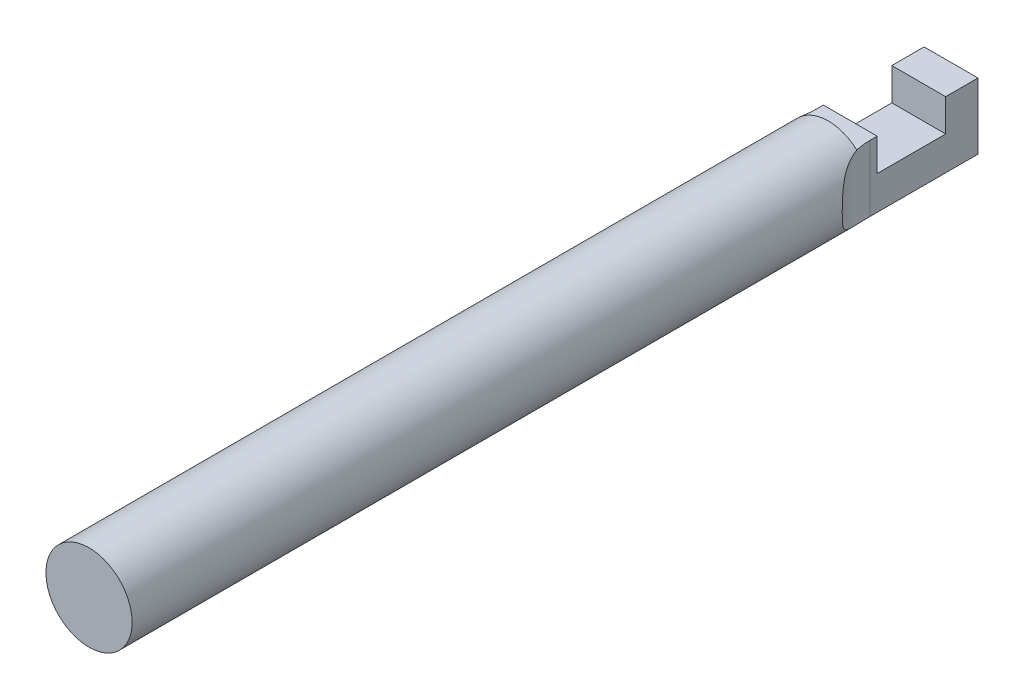
ISO-10303-21;
HEADER;
FILE_DESCRIPTION(('STEP AP214'),'2;1');
FILE_NAME('part.step','',(''),(''),'','','');
FILE_SCHEMA(('AUTOMOTIVE_DESIGN { 1 0 10303 214 1 1 1 1 }'));
ENDSEC;
DATA;
#1=APPLICATION_CONTEXT('core data for automotive mechanical design processes');
#2=APPLICATION_PROTOCOL_DEFINITION('international standard','automotive_design',2000,#1);
#3=PRODUCT_CONTEXT('',#1,'mechanical');
#4=PRODUCT('Part','Part','',(#3));
#5=PRODUCT_RELATED_PRODUCT_CATEGORY('part','',(#4));
#6=PRODUCT_DEFINITION_FORMATION('','',#4);
#7=PRODUCT_DEFINITION_CONTEXT('part definition',#1,'design');
#8=PRODUCT_DEFINITION('design','',#6,#7);
#9=PRODUCT_DEFINITION_SHAPE('','',#8);
#10=(LENGTH_UNIT() NAMED_UNIT(*) SI_UNIT(.MILLI.,.METRE.));
#11=(NAMED_UNIT(*) PLANE_ANGLE_UNIT() SI_UNIT($,.RADIAN.));
#12=(NAMED_UNIT(*) SI_UNIT($,.STERADIAN.) SOLID_ANGLE_UNIT());
#13=UNCERTAINTY_MEASURE_WITH_UNIT(LENGTH_MEASURE(1.E-05),#10,'distance_accuracy_value','');
#14=(GEOMETRIC_REPRESENTATION_CONTEXT(3) GLOBAL_UNCERTAINTY_ASSIGNED_CONTEXT((#13)) GLOBAL_UNIT_ASSIGNED_CONTEXT((#10,
#11,#12)) REPRESENTATION_CONTEXT('',''));
#15=CARTESIAN_POINT('',(0.,0.,0.));
#16=DIRECTION('',(0.,0.,1.));
#17=DIRECTION('',(1.,0.,0.));
#18=AXIS2_PLACEMENT_3D('',#15,#16,#17);
#19=CARTESIAN_POINT('',(1.25,2.,0.));
#20=DIRECTION('',(1.,0.,0.));
#21=DIRECTION('',(0.,0.,-1.));
#22=AXIS2_PLACEMENT_3D('',#19,#20,#21);
#23=PLANE('',#22);
#24=DIRECTION('',(0.,0.,-1.));
#25=VECTOR('',#24,1.);
#26=CARTESIAN_POINT('',(1.25,0.,1.5));
#27=LINE('',#26,#25);
#28=CARTESIAN_POINT('',(1.25,0.,4.675));
#29=VERTEX_POINT('',#28);
#30=CARTESIAN_POINT('',(1.25,0.,1.5));
#31=VERTEX_POINT('',#30);
#32=EDGE_CURVE('E146',#29,#31,#27,.T.);
#33=ORIENTED_EDGE('',*,*,#32,.F.);
#34=DIRECTION('',(0.,-1.,0.));
#35=VECTOR('',#34,1.);
#36=CARTESIAN_POINT('',(1.25,2.,4.675));
#37=LINE('',#36,#35);
#38=CARTESIAN_POINT('',(1.25,1.5,4.675));
#39=VERTEX_POINT('',#38);
#40=EDGE_CURVE('E142',#39,#29,#37,.T.);
#41=ORIENTED_EDGE('',*,*,#40,.F.);
#42=DIRECTION('',(0.,0.,1.));
#43=VECTOR('',#42,1.);
#44=CARTESIAN_POINT('',(1.25,1.5,0.));
#45=LINE('',#44,#43);
#46=CARTESIAN_POINT('',(1.25,1.5,5.));
#47=VERTEX_POINT('',#46);
#48=EDGE_CURVE('E184',#39,#47,#45,.T.);
#49=ORIENTED_EDGE('',*,*,#48,.T.);
#50=DIRECTION('',(0.,-1.,0.));
#51=VECTOR('',#50,1.);
#52=CARTESIAN_POINT('',(1.25,2.,5.));
#53=LINE('',#52,#51);
#54=CARTESIAN_POINT('',(1.25,-1.5612494995996,5.));
#55=VERTEX_POINT('',#54);
#56=EDGE_CURVE('E192',#47,#55,#53,.T.);
#57=ORIENTED_EDGE('',*,*,#56,.T.);
#58=DIRECTION('',(0.,0.,1.));
#59=VECTOR('',#58,1.);
#60=CARTESIAN_POINT('',(1.25,-1.5612494995996,-0.721189591078071));
#61=LINE('',#60,#59);
#62=CARTESIAN_POINT('',(1.25,-1.5612494995996,0.));
#63=VERTEX_POINT('',#62);
#64=EDGE_CURVE('E220',#55,#63,#61,.F.);
#65=ORIENTED_EDGE('',*,*,#64,.T.);
#66=DIRECTION('',(0.,-1.,0.));
#67=VECTOR('',#66,1.);
#68=CARTESIAN_POINT('',(1.25,2.,0.));
#69=LINE('',#68,#67);
#70=CARTESIAN_POINT('',(1.25,1.5,0.));
#71=VERTEX_POINT('',#70);
#72=EDGE_CURVE('E197',#71,#63,#69,.T.);
#73=ORIENTED_EDGE('',*,*,#72,.F.);
#74=CARTESIAN_POINT('',(1.25,1.5,1.5));
#75=VERTEX_POINT('',#74);
#76=EDGE_CURVE('E185',#71,#75,#45,.T.);
#77=ORIENTED_EDGE('',*,*,#76,.T.);
#78=DIRECTION('',(0.,-1.,0.));
#79=VECTOR('',#78,1.);
#80=CARTESIAN_POINT('',(1.25,2.,1.5));
#81=LINE('',#80,#79);
#82=EDGE_CURVE('E63',#75,#31,#81,.T.);
#83=ORIENTED_EDGE('',*,*,#82,.T.);
#84=EDGE_LOOP('',(#33,#41,#49,#57,#65,#73,#77,#83));
#85=FACE_BOUND('',#84,.T.);
#86=ADVANCED_FACE('F47',(#85),#23,.T.);
#87=CARTESIAN_POINT('',(-1.25,2.,0.));
#88=DIRECTION('',(-1.,0.,0.));
#89=DIRECTION('',(0.,0.,1.));
#90=AXIS2_PLACEMENT_3D('',#87,#88,#89);
#91=PLANE('',#90);
#92=DIRECTION('',(0.,0.,-1.));
#93=VECTOR('',#92,1.);
#94=CARTESIAN_POINT('',(-1.25,1.5,0.));
#95=LINE('',#94,#93);
#96=CARTESIAN_POINT('',(-1.25,1.5,5.));
#97=VERTEX_POINT('',#96);
#98=CARTESIAN_POINT('',(-1.25,1.5,4.675));
#99=VERTEX_POINT('',#98);
#100=EDGE_CURVE('E158',#97,#99,#95,.T.);
#101=ORIENTED_EDGE('',*,*,#100,.T.);
#102=DIRECTION('',(0.,-1.,0.));
#103=VECTOR('',#102,1.);
#104=CARTESIAN_POINT('',(-1.25,2.,4.675));
#105=LINE('',#104,#103);
#106=CARTESIAN_POINT('',(-1.25,0.,4.675));
#107=VERTEX_POINT('',#106);
#108=EDGE_CURVE('E140',#99,#107,#105,.T.);
#109=ORIENTED_EDGE('',*,*,#108,.T.);
#110=DIRECTION('',(0.,0.,1.));
#111=VECTOR('',#110,1.);
#112=CARTESIAN_POINT('',(-1.25,0.,4.675));
#113=LINE('',#112,#111);
#114=CARTESIAN_POINT('',(-1.25,0.,1.5));
#115=VERTEX_POINT('',#114);
#116=EDGE_CURVE('E147',#115,#107,#113,.T.);
#117=ORIENTED_EDGE('',*,*,#116,.F.);
#118=DIRECTION('',(0.,-1.,0.));
#119=VECTOR('',#118,1.);
#120=CARTESIAN_POINT('',(-1.25,2.,1.5));
#121=LINE('',#120,#119);
#122=CARTESIAN_POINT('',(-1.25,1.5,1.5));
#123=VERTEX_POINT('',#122);
#124=EDGE_CURVE('E292',#123,#115,#121,.T.);
#125=ORIENTED_EDGE('',*,*,#124,.F.);
#126=CARTESIAN_POINT('',(-1.25,1.5,0.));
#127=VERTEX_POINT('',#126);
#128=EDGE_CURVE('E71',#123,#127,#95,.T.);
#129=ORIENTED_EDGE('',*,*,#128,.T.);
#130=DIRECTION('',(0.,-1.,0.));
#131=VECTOR('',#130,1.);
#132=CARTESIAN_POINT('',(-1.25,2.,0.));
#133=LINE('',#132,#131);
#134=CARTESIAN_POINT('',(-1.25,-1.5612494995996,0.));
#135=VERTEX_POINT('',#134);
#136=EDGE_CURVE('E193',#127,#135,#133,.T.);
#137=ORIENTED_EDGE('',*,*,#136,.T.);
#138=DIRECTION('',(0.,0.,1.));
#139=VECTOR('',#138,1.);
#140=CARTESIAN_POINT('',(-1.25,-1.5612494995996,-0.72118959107807));
#141=LINE('',#140,#139);
#142=CARTESIAN_POINT('',(-1.25,-1.5612494995996,5.));
#143=VERTEX_POINT('',#142);
#144=EDGE_CURVE('E262',#135,#143,#141,.T.);
#145=ORIENTED_EDGE('',*,*,#144,.T.);
#146=DIRECTION('',(0.,-1.,0.));
#147=VECTOR('',#146,1.);
#148=CARTESIAN_POINT('',(-1.25,2.,5.));
#149=LINE('',#148,#147);
#150=EDGE_CURVE('E196',#97,#143,#149,.T.);
#151=ORIENTED_EDGE('',*,*,#150,.F.);
#152=EDGE_LOOP('',(#101,#109,#117,#125,#129,#137,#145,#151));
#153=FACE_BOUND('',#152,.T.);
#154=ADVANCED_FACE('F156',(#153),#91,.T.);
#155=CARTESIAN_POINT('',(0.,1.5,0.));
#156=DIRECTION('',(0.,1.,0.));
#157=DIRECTION('',(0.,0.,1.));
#158=AXIS2_PLACEMENT_3D('',#155,#156,#157);
#159=PLANE('',#158);
#160=ORIENTED_EDGE('',*,*,#48,.F.);
#161=DIRECTION('',(-1.,0.,0.));
#162=VECTOR('',#161,1.);
#163=CARTESIAN_POINT('',(0.,1.5,4.675));
#164=LINE('',#163,#162);
#165=EDGE_CURVE('E11',#39,#99,#164,.T.);
#166=ORIENTED_EDGE('',*,*,#165,.T.);
#167=ORIENTED_EDGE('',*,*,#100,.F.);
#168=CARTESIAN_POINT('',(-4.425,1.5,5.));
#169=DIRECTION('',(0.,1.,0.));
#170=DIRECTION('',(0.,0.,1.));
#171=AXIS2_PLACEMENT_3D('',#168,#169,#170);
#172=CIRCLE('',#171,3.175);
#173=CARTESIAN_POINT('',(-1.3228756555323,1.5,5.67635016926207));
#174=VERTEX_POINT('',#173);
#175=EDGE_CURVE('E172',#174,#97,#172,.T.);
#176=ORIENTED_EDGE('',*,*,#175,.F.);
#177=DIRECTION('',(0.,0.,1.));
#178=VECTOR('',#177,1.);
#179=CARTESIAN_POINT('',(-1.3228756555323,1.5,-0.72118959107807));
#180=LINE('',#179,#178);
#181=CARTESIAN_POINT('',(-1.3228756555323,1.5,5.7));
#182=VERTEX_POINT('',#181);
#183=EDGE_CURVE('E176',#174,#182,#180,.T.);
#184=ORIENTED_EDGE('',*,*,#183,.T.);
#185=DIRECTION('',(1.,0.,0.));
#186=VECTOR('',#185,1.);
#187=CARTESIAN_POINT('',(-2.,1.5,5.7));
#188=LINE('',#187,#186);
#189=CARTESIAN_POINT('',(1.3228756555323,1.5,5.7));
#190=VERTEX_POINT('',#189);
#191=EDGE_CURVE('E164',#182,#190,#188,.T.);
#192=ORIENTED_EDGE('',*,*,#191,.T.);
#193=DIRECTION('',(0.,0.,1.));
#194=VECTOR('',#193,1.);
#195=CARTESIAN_POINT('',(1.3228756555323,1.5,-0.72118959107807));
#196=LINE('',#195,#194);
#197=CARTESIAN_POINT('',(1.3228756555323,1.5,5.67635016926205));
#198=VERTEX_POINT('',#197);
#199=EDGE_CURVE('E189',#190,#198,#196,.F.);
#200=ORIENTED_EDGE('',*,*,#199,.T.);
#201=CARTESIAN_POINT('',(4.425,1.5,5.));
#202=DIRECTION('',(0.,1.,0.));
#203=DIRECTION('',(0.,0.,1.));
#204=AXIS2_PLACEMENT_3D('',#201,#202,#203);
#205=CIRCLE('',#204,3.175);
#206=EDGE_CURVE('E180',#47,#198,#205,.T.);
#207=ORIENTED_EDGE('',*,*,#206,.F.);
#208=EDGE_LOOP('',(#160,#166,#167,#176,#184,#192,#200,#207));
#209=FACE_BOUND('',#208,.T.);
#210=ADVANCED_FACE('F287',(#209),#159,.T.);
#211=ORIENTED_EDGE('',*,*,#128,.F.);
#212=DIRECTION('',(1.,0.,0.));
#213=VECTOR('',#212,1.);
#214=CARTESIAN_POINT('',(0.,1.5,1.5));
#215=LINE('',#214,#213);
#216=EDGE_CURVE('E56',#123,#75,#215,.T.);
#217=ORIENTED_EDGE('',*,*,#216,.T.);
#218=ORIENTED_EDGE('',*,*,#76,.F.);
#219=DIRECTION('',(-1.,0.,0.));
#220=VECTOR('',#219,1.);
#221=CARTESIAN_POINT('',(2.,1.5,0.));
#222=LINE('',#221,#220);
#223=EDGE_CURVE('E160',#71,#127,#222,.T.);
#224=ORIENTED_EDGE('',*,*,#223,.T.);
#225=EDGE_LOOP('',(#211,#217,#218,#224));
#226=FACE_BOUND('',#225,.T.);
#227=ADVANCED_FACE('F276',(#226),#159,.T.);
#228=CARTESIAN_POINT('',(0.,0.,0.));
#229=DIRECTION('',(0.,0.,1.));
#230=DIRECTION('',(1.,0.,0.));
#231=AXIS2_PLACEMENT_3D('',#228,#229,#230);
#232=PLANE('',#231);
#233=ORIENTED_EDGE('',*,*,#223,.F.);
#234=ORIENTED_EDGE('',*,*,#72,.T.);
#235=CARTESIAN_POINT('',(0.,0.,0.));
#236=DIRECTION('',(0.,0.,1.));
#237=DIRECTION('',(1.,0.,0.));
#238=AXIS2_PLACEMENT_3D('',#235,#236,#237);
#239=CIRCLE('',#238,2.);
#240=EDGE_CURVE('E208',#135,#63,#239,.T.);
#241=ORIENTED_EDGE('',*,*,#240,.F.);
#242=ORIENTED_EDGE('',*,*,#136,.F.);
#243=EDGE_LOOP('',(#233,#234,#241,#242));
#244=FACE_BOUND('',#243,.T.);
#245=ADVANCED_FACE('F49',(#244),#232,.F.);
#246=CARTESIAN_POINT('',(0.,0.,-0.72118959107807));
#247=DIRECTION('',(0.,0.,1.));
#248=DIRECTION('',(1.,0.,0.));
#249=AXIS2_PLACEMENT_3D('',#246,#247,#248);
#250=CYLINDRICAL_SURFACE('',#249,2.);
#251=CARTESIAN_POINT('',(0.,0.,40.));
#252=DIRECTION('',(0.,0.,1.));
#253=DIRECTION('',(1.,0.,0.));
#254=AXIS2_PLACEMENT_3D('',#251,#252,#253);
#255=CIRCLE('',#254,2.);
#256=CARTESIAN_POINT('',(2.,0.,40.));
#257=VERTEX_POINT('',#256);
#258=EDGE_CURVE('E200',#257,#257,#255,.T.);
#259=ORIENTED_EDGE('',*,*,#258,.F.);
#260=EDGE_LOOP('',(#259));
#261=FACE_BOUND('',#260,.T.);
#262=ORIENTED_EDGE('',*,*,#183,.F.);
#263=CARTESIAN_POINT('',(-2.,0.,2.95060984680808));
#264=CARTESIAN_POINT('',(-1.99999526771597,-0.0762342988127195,2.95061134494224));
#265=CARTESIAN_POINT('',(-1.99560464291432,-0.152525382786925,2.95577604038216));
#266=CARTESIAN_POINT('',(-1.9783982569047,-0.302777792129147,2.97640485586222));
#267=CARTESIAN_POINT('',(-1.96557305993326,-0.376736410947031,2.99188051103654));
#268=CARTESIAN_POINT('',(-1.93263513662938,-0.51990893844574,3.0329140900328));
#269=CARTESIAN_POINT('',(-1.91253744455988,-0.589132287735249,3.05845122359317));
#270=CARTESIAN_POINT('',(-1.86676823380276,-0.721153402179914,3.11917266714513));
#271=CARTESIAN_POINT('',(-1.8410980137628,-0.783952659426922,3.15435472993915));
#272=CARTESIAN_POINT('',(-1.78616857113581,-0.902148535941585,3.2337820887696));
#273=CARTESIAN_POINT('',(-1.756895100379,-0.957513831273317,3.27806386116998));
#274=CARTESIAN_POINT('',(-1.69704347010147,-1.05998669363776,3.37454595242543));
#275=CARTESIAN_POINT('',(-1.66646490940226,-1.10709169843078,3.42674871894166));
#276=CARTESIAN_POINT('',(-1.60234708250298,-1.19831719930569,3.54457229620845));
#277=CARTESIAN_POINT('',(-1.56889757624369,-1.24138591876254,3.6110524431962));
#278=CARTESIAN_POINT('',(-1.50512668669525,-1.31798409099175,3.75065183700141));
#279=CARTESIAN_POINT('',(-1.47480736548522,-1.35150728067317,3.82377540144519));
#280=CARTESIAN_POINT('',(-1.41343197923259,-1.41582726650505,3.98986824931109));
#281=CARTESIAN_POINT('',(-1.38339612530998,-1.44480205357975,4.08391828489662));
#282=CARTESIAN_POINT('',(-1.33183960258527,-1.49245771292548,4.2768235393786));
#283=CARTESIAN_POINT('',(-1.31032469829807,-1.51113161988272,4.37568196060628));
#284=CARTESIAN_POINT('',(-1.27327027520583,-1.54256517113849,4.59713188446389));
#285=CARTESIAN_POINT('',(-1.25990686060441,-1.55328453785114,4.72038005504641));
#286=CARTESIAN_POINT('',(-1.24773430906459,-1.56308125748609,4.96819663442384));
#287=CARTESIAN_POINT('',(-1.24894092962009,-1.562146005903,5.09276632700215));
#288=CARTESIAN_POINT('',(-1.26208586170716,-1.55150123812427,5.28526802488911));
#289=CARTESIAN_POINT('',(-1.26902851303385,-1.54586610670678,5.35382232416731));
#290=CARTESIAN_POINT('',(-1.28727929665149,-1.5307050990722,5.48994222322506));
#291=CARTESIAN_POINT('',(-1.29858818347311,-1.52117855036144,5.55750765002148));
#292=CARTESIAN_POINT('',(-1.32536279406065,-1.49790761466492,5.69101691601224));
#293=CARTESIAN_POINT('',(-1.3408249941663,-1.4841668016554,5.7569620783086));
#294=CARTESIAN_POINT('',(-1.3755732531246,-1.45201789354017,5.88664053049356));
#295=CARTESIAN_POINT('',(-1.39485789034395,-1.43361153292832,5.95037463239138));
#296=CARTESIAN_POINT('',(-1.44679025287126,-1.38156984553164,6.10465898691835));
#297=CARTESIAN_POINT('',(-1.48143119773286,-1.34485513346151,6.19354549096928));
#298=CARTESIAN_POINT('',(-1.55564652532878,-1.25825050548903,6.36231731105417));
#299=CARTESIAN_POINT('',(-1.59521254073614,-1.20838277851879,6.4422174661216));
#300=CARTESIAN_POINT('',(-1.66878303422644,-1.10386256167131,6.57759226547195));
#301=CARTESIAN_POINT('',(-1.70258843701005,-1.051467629832,6.6349097562009));
#302=CARTESIAN_POINT('',(-1.76836643951117,-0.936614926654416,6.73975668052221));
#303=CARTESIAN_POINT('',(-1.80033953516847,-0.874159895831136,6.78728877178684));
#304=CARTESIAN_POINT('',(-1.85964113041086,-0.739699328132647,6.87142679043252));
#305=CARTESIAN_POINT('',(-1.88694248936908,-0.667642040251549,6.90796974703919));
#306=CARTESIAN_POINT('',(-1.93385655165196,-0.516205372265931,6.96883792215968));
#307=CARTESIAN_POINT('',(-1.95347154220399,-0.436828179039115,6.99316677582253));
#308=CARTESIAN_POINT('',(-1.9814205660291,-0.281986875881387,7.02730835804443));
#309=CARTESIAN_POINT('',(-1.9907106488646,-0.206965632073013,7.038361039175));
#310=CARTESIAN_POINT('',(-2.00066510460769,-0.0555597933592414,7.05019254785694));
#311=CARTESIAN_POINT('',(-2.00133216111963,0.0208243699758779,7.05097457177923));
#312=CARTESIAN_POINT('',(-1.99414695490843,0.169324703688466,7.04245033615458));
#313=CARTESIAN_POINT('',(-1.98665714421366,0.241483875298227,7.03357329413727));
#314=CARTESIAN_POINT('',(-1.96432088060578,0.382833870523987,7.00648656996314));
#315=CARTESIAN_POINT('',(-1.94947552079687,0.452025133539671,6.98827827450508));
#316=CARTESIAN_POINT('',(-1.91347056738933,0.586073017136195,6.94259862844781));
#317=CARTESIAN_POINT('',(-1.89226906206142,0.650897254752827,6.91506563045));
#318=CARTESIAN_POINT('',(-1.84524793127226,0.77422264401958,6.85123461050419));
#319=CARTESIAN_POINT('',(-1.81942772687172,0.832723001514894,6.81493548955058));
#320=CARTESIAN_POINT('',(-1.76356949579395,0.945518545159535,6.73206155840377));
#321=CARTESIAN_POINT('',(-1.73337654047684,0.999397182736941,6.68502653160736));
#322=CARTESIAN_POINT('',(-1.67223178320565,1.09865714601099,6.58316857958408));
#323=CARTESIAN_POINT('',(-1.64127966413039,1.14403484986121,6.5283423523095));
#324=CARTESIAN_POINT('',(-1.57664276302938,1.23189055402963,6.40462070941985));
#325=CARTESIAN_POINT('',(-1.54312830939416,1.27321784978073,6.33482296098465));
#326=CARTESIAN_POINT('',(-1.47987635679495,1.34621773837904,6.18879059952789));
#327=CARTESIAN_POINT('',(-1.4501413279354,1.37788403586045,6.112551830499));
#328=CARTESIAN_POINT('',(-1.39048019537234,1.43830758186327,5.93931315863926));
#329=CARTESIAN_POINT('',(-1.36174311405429,1.46516609340884,5.8412425812436));
#330=CARTESIAN_POINT('',(-1.3135863812272,1.50848689292887,5.64062927604266));
#331=CARTESIAN_POINT('',(-1.29417311840823,1.524942054953,5.53808353418503));
#332=CARTESIAN_POINT('',(-1.26263228099809,1.55121893984813,5.30964393606893));
#333=CARTESIAN_POINT('',(-1.25275757284855,1.55903891233917,5.18320495512933));
#334=CARTESIAN_POINT('',(-1.24824650130194,1.56265592079673,4.92971418422032));
#335=CARTESIAN_POINT('',(-1.25362737721587,1.55843935504284,4.80266186306867));
#336=CARTESIAN_POINT('',(-1.2735048935593,1.54215645146548,4.60820310716855));
#337=CARTESIAN_POINT('',(-1.28277224179501,1.53450770645057,4.53983211822554));
#338=CARTESIAN_POINT('',(-1.30561551386533,1.51512322674917,4.40436861154225));
#339=CARTESIAN_POINT('',(-1.31919220766992,1.50338676165504,4.33727632454599));
#340=CARTESIAN_POINT('',(-1.35037584361571,1.47543958895874,4.20506769439501));
#341=CARTESIAN_POINT('',(-1.36797783714652,1.45923437014469,4.13994903532066));
#342=CARTESIAN_POINT('',(-1.40679948973874,1.42184369001904,4.01230383138135));
#343=CARTESIAN_POINT('',(-1.42801753871391,1.40066044364215,3.94977614819489));
#344=CARTESIAN_POINT('',(-1.48297232638483,1.34275597148607,3.80269895874404));
#345=CARTESIAN_POINT('',(-1.51824882030935,1.30323526032715,3.71978639502719));
#346=CARTESIAN_POINT('',(-1.59239684766762,1.2114980448467,3.56317258759072));
#347=CARTESIAN_POINT('',(-1.63126227538327,1.15930286522422,3.48945618349198));
#348=CARTESIAN_POINT('',(-1.70287337067346,1.0505989307474,3.36445352538056));
#349=CARTESIAN_POINT('',(-1.735620270627,0.99605932383829,3.311462963758));
#350=CARTESIAN_POINT('',(-1.79845885657562,0.877516063673315,3.2152841973358));
#351=CARTESIAN_POINT('',(-1.82855038903976,0.813511863754988,3.17209655910563));
#352=CARTESIAN_POINT('',(-1.88344021109715,0.676832358849193,3.09650161093919));
#353=CARTESIAN_POINT('',(-1.90820906488991,0.604112132023532,3.06415372372057));
#354=CARTESIAN_POINT('',(-1.94974020213308,0.452404561720888,3.01131707820137));
#355=CARTESIAN_POINT('',(-1.96651446415353,0.373426802525621,2.99081056774351));
#356=CARTESIAN_POINT('',(-1.98556127088107,0.244772202946208,2.96778997591311));
#357=CARTESIAN_POINT('',(-1.99095625614911,0.19620757096862,2.96135156636088));
#358=CARTESIAN_POINT('',(-1.99817709184962,0.0984365059116552,2.95276108635552));
#359=CARTESIAN_POINT('',(-2.00000305598383,0.0492300933283796,2.95060887935267));
#360=CARTESIAN_POINT('',(-2.,0.,2.95060984680808));
#361=B_SPLINE_CURVE_WITH_KNOTS('',3,(#263,#264,#265,#266,#267,#268,#269,#270,#271,#272,#273,
#274,#275,#276,#277,#278,#279,#280,#281,#282,#283,#284,#285,#286,#287,#288,#289,#290,#291,#292,
#293,#294,#295,#296,#297,#298,#299,#300,#301,#302,#303,#304,#305,#306,#307,#308,#309,#310,#311,
#312,#313,#314,#315,#316,#317,#318,#319,#320,#321,#322,#323,#324,#325,#326,#327,#328,#329,#330,
#331,#332,#333,#334,#335,#336,#337,#338,#339,#340,#341,#342,#343,#344,#345,#346,#347,#348,#349,
#350,#351,#352,#353,#354,#355,#356,#357,#358,#359,#360),.UNSPECIFIED.,.T.,.F.,(4,2,2,2,2,2,2,2,
2,2,2,2,2,2,2,2,2,2,2,2,2,2,2,2,2,2,2,2,2,2,2,2,2,2,2,2,2,2,2,2,2,2,2,2,2,2,2,2,4),(0.,
0.228504704024761,0.457265472297835,0.685556005394684,0.913793393616535,1.14296417571971,
1.37220591849736,1.62920163394914,1.88636558500929,2.19393057630638,2.50170328468858,
2.87354226013812,3.24578341544758,3.45297276271542,3.66019793048327,3.8672478412245,
4.07422089037355,4.37963737228872,4.68454188064489,4.93757096633867,5.19053123949785,
5.44491457216944,5.6992221505811,5.92725848671555,6.15522385309825,6.37345797177143,
6.59165966851267,6.81133305048652,7.03103398714179,7.2629891379901,7.49504289033208,
7.75737178066263,8.01987124822011,8.33571242437045,8.65176970755692,9.03144093291045,
9.41154137016798,9.61957459305712,9.82764500711231,10.0354609864021,10.2431846740763,
10.5371635111574,10.8306511169965,11.0779852671495,11.3253337085822,11.5740167229924,
11.82232594652,11.9698929403484,12.1174552329163),.UNSPECIFIED.);
#362=EDGE_CURVE('E255',#143,#174,#361,.T.);
#363=ORIENTED_EDGE('',*,*,#362,.F.);
#364=ORIENTED_EDGE('',*,*,#144,.F.);
#365=ORIENTED_EDGE('',*,*,#240,.T.);
#366=ORIENTED_EDGE('',*,*,#64,.F.);
#367=CARTESIAN_POINT('',(2.,0.,2.95060984680808));
#368=CARTESIAN_POINT('',(1.99999526771597,0.0762342988127194,2.95061134494225));
#369=CARTESIAN_POINT('',(1.99560464291432,0.152525382786924,2.95577604038216));
#370=CARTESIAN_POINT('',(1.9783982569047,0.302777792129147,2.97640485586222));
#371=CARTESIAN_POINT('',(1.96557305993326,0.376736410947031,2.99188051103654));
#372=CARTESIAN_POINT('',(1.93263513662938,0.51990893844574,3.0329140900328));
#373=CARTESIAN_POINT('',(1.91253744455988,0.589132287735249,3.05845122359318));
#374=CARTESIAN_POINT('',(1.86676823380276,0.721153402179914,3.11917266714513));
#375=CARTESIAN_POINT('',(1.8410980137628,0.783952659426921,3.15435472993916));
#376=CARTESIAN_POINT('',(1.78616857113581,0.902148535941584,3.2337820887696));
#377=CARTESIAN_POINT('',(1.75689510037901,0.957513831273315,3.27806386116998));
#378=CARTESIAN_POINT('',(1.69704347010147,1.05998669363776,3.37454595242543));
#379=CARTESIAN_POINT('',(1.66646490940226,1.10709169843078,3.42674871894166));
#380=CARTESIAN_POINT('',(1.60234708250298,1.19831719930569,3.54457229620845));
#381=CARTESIAN_POINT('',(1.56889757624369,1.24138591876253,3.61105244319621));
#382=CARTESIAN_POINT('',(1.50512668669525,1.31798409099175,3.75065183700141));
#383=CARTESIAN_POINT('',(1.47480736548523,1.35150728067317,3.8237754014452));
#384=CARTESIAN_POINT('',(1.41343197923259,1.41582726650505,3.98986824931109));
#385=CARTESIAN_POINT('',(1.38339612530999,1.44480205357975,4.08391828489662));
#386=CARTESIAN_POINT('',(1.33183960258528,1.49245771292547,4.27682353937861));
#387=CARTESIAN_POINT('',(1.31032469829808,1.51113161988272,4.37568196060628));
#388=CARTESIAN_POINT('',(1.27327027520583,1.54256517113848,4.5971318844639));
#389=CARTESIAN_POINT('',(1.25990686060442,1.55328453785114,4.72038005504641));
#390=CARTESIAN_POINT('',(1.24773430906459,1.56308125748608,4.96819663442384));
#391=CARTESIAN_POINT('',(1.2489409296201,1.562146005903,5.09276632700216));
#392=CARTESIAN_POINT('',(1.26208586170716,1.55150123812427,5.28526802488912));
#393=CARTESIAN_POINT('',(1.26902851303385,1.54586610670677,5.35382232416732));
#394=CARTESIAN_POINT('',(1.2872792966515,1.5307050990722,5.48994222322507));
#395=CARTESIAN_POINT('',(1.29858818347311,1.52117855036143,5.55750765002149));
#396=CARTESIAN_POINT('',(1.32536279406065,1.49790761466491,5.69101691601224));
#397=CARTESIAN_POINT('',(1.3408249941663,1.48416680165539,5.7569620783086));
#398=CARTESIAN_POINT('',(1.37557325312461,1.45201789354017,5.88664053049356));
#399=CARTESIAN_POINT('',(1.39485789034396,1.43361153292831,5.95037463239138));
#400=CARTESIAN_POINT('',(1.44679025287126,1.38156984553163,6.10465898691835));
#401=CARTESIAN_POINT('',(1.48143119773286,1.34485513346151,6.19354549096928));
#402=CARTESIAN_POINT('',(1.55564652532879,1.25825050548902,6.36231731105417));
#403=CARTESIAN_POINT('',(1.59521254073614,1.20838277851878,6.4422174661216));
#404=CARTESIAN_POINT('',(1.66878303422644,1.1038625616713,6.57759226547195));
#405=CARTESIAN_POINT('',(1.70258843701005,1.051467629832,6.6349097562009));
#406=CARTESIAN_POINT('',(1.76836643951117,0.936614926654411,6.73975668052221));
#407=CARTESIAN_POINT('',(1.80033953516847,0.874159895831131,6.78728877178684));
#408=CARTESIAN_POINT('',(1.85964113041086,0.739699328132642,6.87142679043251));
#409=CARTESIAN_POINT('',(1.88694248936908,0.667642040251544,6.90796974703918));
#410=CARTESIAN_POINT('',(1.93385655165196,0.516205372265926,6.96883792215968));
#411=CARTESIAN_POINT('',(1.95347154220399,0.436828179039111,6.99316677582252));
#412=CARTESIAN_POINT('',(1.98142056602911,0.281986875881383,7.02730835804442));
#413=CARTESIAN_POINT('',(1.9907106488646,0.206965632073009,7.03836103917499));
#414=CARTESIAN_POINT('',(2.00066510460769,0.0555597933592376,7.05019254785693));
#415=CARTESIAN_POINT('',(2.00133216111963,-0.0208243699758811,7.05097457177923));
#416=CARTESIAN_POINT('',(1.99414695490843,-0.169324703688469,7.04245033615458));
#417=CARTESIAN_POINT('',(1.98665714421366,-0.241483875298229,7.03357329413726));
#418=CARTESIAN_POINT('',(1.96432088060578,-0.382833870523988,7.00648656996313));
#419=CARTESIAN_POINT('',(1.94947552079687,-0.452025133539673,6.98827827450507));
#420=CARTESIAN_POINT('',(1.91347056738933,-0.586073017136196,6.9425986284478));
#421=CARTESIAN_POINT('',(1.89226906206142,-0.650897254752828,6.91506563044999));
#422=CARTESIAN_POINT('',(1.84524793127226,-0.774222644019581,6.85123461050418));
#423=CARTESIAN_POINT('',(1.81942772687172,-0.832723001514895,6.81493548955057));
#424=CARTESIAN_POINT('',(1.76356949579395,-0.945518545159536,6.73206155840377));
#425=CARTESIAN_POINT('',(1.73337654047683,-0.999397182736942,6.68502653160736));
#426=CARTESIAN_POINT('',(1.67223178320565,-1.09865714601099,6.58316857958407));
#427=CARTESIAN_POINT('',(1.64127966413039,-1.14403484986121,6.52834235230949));
#428=CARTESIAN_POINT('',(1.57664276302938,-1.23189055402963,6.40462070941985));
#429=CARTESIAN_POINT('',(1.54312830939416,-1.27321784978073,6.33482296098464));
#430=CARTESIAN_POINT('',(1.47987635679495,-1.34621773837904,6.18879059952788));
#431=CARTESIAN_POINT('',(1.45014132793541,-1.37788403586045,6.11255183049899));
#432=CARTESIAN_POINT('',(1.39048019537235,-1.43830758186327,5.93931315863926));
#433=CARTESIAN_POINT('',(1.36174311405429,-1.46516609340884,5.84124258124359));
#434=CARTESIAN_POINT('',(1.3135863812272,-1.50848689292886,5.64062927604265));
#435=CARTESIAN_POINT('',(1.29417311840823,-1.52494205495299,5.53808353418502));
#436=CARTESIAN_POINT('',(1.26263228099809,-1.55121893984813,5.30964393606892));
#437=CARTESIAN_POINT('',(1.25275757284856,-1.55903891233916,5.18320495512932));
#438=CARTESIAN_POINT('',(1.24824650130194,-1.56265592079673,4.92971418422031));
#439=CARTESIAN_POINT('',(1.25362737721588,-1.55843935504283,4.80266186306867));
#440=CARTESIAN_POINT('',(1.27350489355931,-1.54215645146548,4.60820310716854));
#441=CARTESIAN_POINT('',(1.28277224179501,-1.53450770645057,4.53983211822553));
#442=CARTESIAN_POINT('',(1.30561551386534,-1.51512322674917,4.40436861154224));
#443=CARTESIAN_POINT('',(1.31919220766992,-1.50338676165503,4.33727632454599));
#444=CARTESIAN_POINT('',(1.35037584361572,-1.47543958895874,4.205067694395));
#445=CARTESIAN_POINT('',(1.36797783714653,-1.45923437014469,4.13994903532066));
#446=CARTESIAN_POINT('',(1.40679948973875,-1.42184369001903,4.01230383138134));
#447=CARTESIAN_POINT('',(1.42801753871391,-1.40066044364215,3.94977614819489));
#448=CARTESIAN_POINT('',(1.48297232638483,-1.34275597148606,3.80269895874404));
#449=CARTESIAN_POINT('',(1.51824882030936,-1.30323526032714,3.71978639502719));
#450=CARTESIAN_POINT('',(1.59239684766762,-1.21149804484669,3.56317258759072));
#451=CARTESIAN_POINT('',(1.63126227538327,-1.15930286522422,3.48945618349198));
#452=CARTESIAN_POINT('',(1.70287337067347,-1.0505989307474,3.36445352538056));
#453=CARTESIAN_POINT('',(1.735620270627,-0.996059323838284,3.311462963758));
#454=CARTESIAN_POINT('',(1.79845885657563,-0.877516063673308,3.2152841973358));
#455=CARTESIAN_POINT('',(1.82855038903976,-0.813511863754982,3.17209655910563));
#456=CARTESIAN_POINT('',(1.88344021109716,-0.676832358849188,3.09650161093919));
#457=CARTESIAN_POINT('',(1.90820906488991,-0.604112132023527,3.06415372372057));
#458=CARTESIAN_POINT('',(1.94974020213308,-0.452404561720883,3.01131707820137));
#459=CARTESIAN_POINT('',(1.96651446415353,-0.373426802525616,2.99081056774351));
#460=CARTESIAN_POINT('',(1.98556127088107,-0.244772202946205,2.96778997591311));
#461=CARTESIAN_POINT('',(1.99095625614911,-0.196207570968617,2.96135156636089));
#462=CARTESIAN_POINT('',(1.99817709184962,-0.0984365059116542,2.95276108635553));
#463=CARTESIAN_POINT('',(2.00000305598383,-0.0492300933283791,2.95060887935267));
#464=CARTESIAN_POINT('',(2.,0.,2.95060984680808));
#465=B_SPLINE_CURVE_WITH_KNOTS('',3,(#367,#368,#369,#370,#371,#372,#373,#374,#375,#376,#377,
#378,#379,#380,#381,#382,#383,#384,#385,#386,#387,#388,#389,#390,#391,#392,#393,#394,#395,#396,
#397,#398,#399,#400,#401,#402,#403,#404,#405,#406,#407,#408,#409,#410,#411,#412,#413,#414,#415,
#416,#417,#418,#419,#420,#421,#422,#423,#424,#425,#426,#427,#428,#429,#430,#431,#432,#433,#434,
#435,#436,#437,#438,#439,#440,#441,#442,#443,#444,#445,#446,#447,#448,#449,#450,#451,#452,#453,
#454,#455,#456,#457,#458,#459,#460,#461,#462,#463,#464),.UNSPECIFIED.,.T.,.F.,(4,2,2,2,2,2,2,2,
2,2,2,2,2,2,2,2,2,2,2,2,2,2,2,2,2,2,2,2,2,2,2,2,2,2,2,2,2,2,2,2,2,2,2,2,2,2,2,2,4),(0.,
0.228504704024761,0.457265472297835,0.685556005394684,0.913793393616534,1.14296417571971,
1.37220591849736,1.62920163394913,1.88636558500929,2.19393057630637,2.50170328468858,
2.87354226013812,3.24578341544757,3.45297276271542,3.66019793048326,3.86724784122449,
4.07422089037355,4.37963737228871,4.68454188064488,4.93757096633866,5.19053123949784,
5.44491457216942,5.69922215058109,5.92725848671553,6.15522385309824,6.37345797177141,
6.59165966851266,6.8113330504865,7.03103398714177,7.26298913799008,7.49504289033206,
7.75737178066262,8.01987124822009,8.33571242437043,8.6517697075569,9.03144093291044,
9.41154137016796,9.6195745930571,9.82764500711229,10.0354609864021,10.2431846740763,
10.5371635111574,10.8306511169964,11.0779852671495,11.3253337085822,11.5740167229924,
11.82232594652,11.9698929403484,12.1174552329163),.UNSPECIFIED.);
#466=EDGE_CURVE('E212',#198,#55,#465,.T.);
#467=ORIENTED_EDGE('',*,*,#466,.F.);
#468=ORIENTED_EDGE('',*,*,#199,.F.);
#469=CARTESIAN_POINT('',(0.,0.,5.7));
#470=DIRECTION('',(0.,0.,-1.));
#471=DIRECTION('',(-1.,0.,0.));
#472=AXIS2_PLACEMENT_3D('',#469,#470,#471);
#473=CIRCLE('',#472,2.);
#474=EDGE_CURVE('E257',#182,#190,#473,.T.);
#475=ORIENTED_EDGE('',*,*,#474,.F.);
#476=EDGE_LOOP('',(#262,#363,#364,#365,#366,#467,#468,#475));
#477=FACE_BOUND('',#476,.T.);
#478=ADVANCED_FACE('F222',(#261,#477),#250,.T.);
#479=CARTESIAN_POINT('',(4.425,2.,5.));
#480=DIRECTION('',(0.,-1.,0.));
#481=DIRECTION('',(0.,0.,-1.));
#482=AXIS2_PLACEMENT_3D('',#479,#480,#481);
#483=CYLINDRICAL_SURFACE('',#482,3.175);
#484=ORIENTED_EDGE('',*,*,#56,.F.);
#485=ORIENTED_EDGE('',*,*,#206,.T.);
#486=ORIENTED_EDGE('',*,*,#466,.T.);
#487=EDGE_LOOP('',(#484,#485,#486));
#488=FACE_BOUND('',#487,.T.);
#489=ADVANCED_FACE('F225',(#488),#483,.F.);
#490=CARTESIAN_POINT('',(-4.425,2.,5.));
#491=DIRECTION('',(0.,-1.,0.));
#492=DIRECTION('',(0.,0.,-1.));
#493=AXIS2_PLACEMENT_3D('',#490,#491,#492);
#494=CYLINDRICAL_SURFACE('',#493,3.175);
#495=ORIENTED_EDGE('',*,*,#362,.T.);
#496=ORIENTED_EDGE('',*,*,#175,.T.);
#497=ORIENTED_EDGE('',*,*,#150,.T.);
#498=EDGE_LOOP('',(#495,#496,#497));
#499=FACE_BOUND('',#498,.T.);
#500=ADVANCED_FACE('F230',(#499),#494,.F.);
#501=CARTESIAN_POINT('',(0.,2.,40.));
#502=DIRECTION('',(0.,0.,-1.));
#503=DIRECTION('',(-1.,0.,0.));
#504=AXIS2_PLACEMENT_3D('',#501,#502,#503);
#505=PLANE('',#504);
#506=ORIENTED_EDGE('',*,*,#258,.T.);
#507=EDGE_LOOP('',(#506));
#508=FACE_BOUND('',#507,.T.);
#509=ADVANCED_FACE('F236',(#508),#505,.F.);
#510=CARTESIAN_POINT('',(-2.,2.,5.7));
#511=DIRECTION('',(0.,0.,-1.));
#512=DIRECTION('',(-1.,0.,0.));
#513=AXIS2_PLACEMENT_3D('',#510,#511,#512);
#514=PLANE('',#513);
#515=ORIENTED_EDGE('',*,*,#191,.F.);
#516=ORIENTED_EDGE('',*,*,#474,.T.);
#517=EDGE_LOOP('',(#515,#516));
#518=FACE_BOUND('',#517,.T.);
#519=ADVANCED_FACE('F238',(#518),#514,.T.);
#520=CARTESIAN_POINT('',(1.25,2.,4.675));
#521=DIRECTION('',(0.,0.,-1.));
#522=DIRECTION('',(-1.,0.,0.));
#523=AXIS2_PLACEMENT_3D('',#520,#521,#522);
#524=PLANE('',#523);
#525=ORIENTED_EDGE('',*,*,#40,.T.);
#526=DIRECTION('',(1.,0.,0.));
#527=VECTOR('',#526,1.);
#528=CARTESIAN_POINT('',(1.25,0.,4.675));
#529=LINE('',#528,#527);
#530=EDGE_CURVE('E136',#107,#29,#529,.T.);
#531=ORIENTED_EDGE('',*,*,#530,.F.);
#532=ORIENTED_EDGE('',*,*,#108,.F.);
#533=ORIENTED_EDGE('',*,*,#165,.F.);
#534=EDGE_LOOP('',(#525,#531,#532,#533));
#535=FACE_BOUND('',#534,.T.);
#536=ADVANCED_FACE('F138',(#535),#524,.T.);
#537=CARTESIAN_POINT('',(-1.25,2.,1.5));
#538=DIRECTION('',(0.,0.,1.));
#539=DIRECTION('',(1.,0.,0.));
#540=AXIS2_PLACEMENT_3D('',#537,#538,#539);
#541=PLANE('',#540);
#542=ORIENTED_EDGE('',*,*,#124,.T.);
#543=DIRECTION('',(-1.,0.,0.));
#544=VECTOR('',#543,1.);
#545=CARTESIAN_POINT('',(-1.25,0.,1.5));
#546=LINE('',#545,#544);
#547=EDGE_CURVE('E152',#31,#115,#546,.T.);
#548=ORIENTED_EDGE('',*,*,#547,.F.);
#549=ORIENTED_EDGE('',*,*,#82,.F.);
#550=ORIENTED_EDGE('',*,*,#216,.F.);
#551=EDGE_LOOP('',(#542,#548,#549,#550));
#552=FACE_BOUND('',#551,.T.);
#553=ADVANCED_FACE('F297',(#552),#541,.T.);
#554=CARTESIAN_POINT('',(0.,0.,0.));
#555=DIRECTION('',(0.,-1.,0.));
#556=DIRECTION('',(0.,0.,-1.));
#557=AXIS2_PLACEMENT_3D('',#554,#555,#556);
#558=PLANE('',#557);
#559=ORIENTED_EDGE('',*,*,#116,.T.);
#560=ORIENTED_EDGE('',*,*,#530,.T.);
#561=ORIENTED_EDGE('',*,*,#32,.T.);
#562=ORIENTED_EDGE('',*,*,#547,.T.);
#563=EDGE_LOOP('',(#559,#560,#561,#562));
#564=FACE_BOUND('',#563,.T.);
#565=ADVANCED_FACE('F151',(#564),#558,.F.);
#566=CLOSED_SHELL('',(#86,#154,#210,#227,#245,#478,#489,#500,#509,#519,#536,#553,#565));
#567=MANIFOLD_SOLID_BREP('B2',#566);
#568=ADVANCED_BREP_SHAPE_REPRESENTATION('',(#18,#567),#14);
#569=SHAPE_DEFINITION_REPRESENTATION(#9,#568);
ENDSEC;
END-ISO-10303-21;
